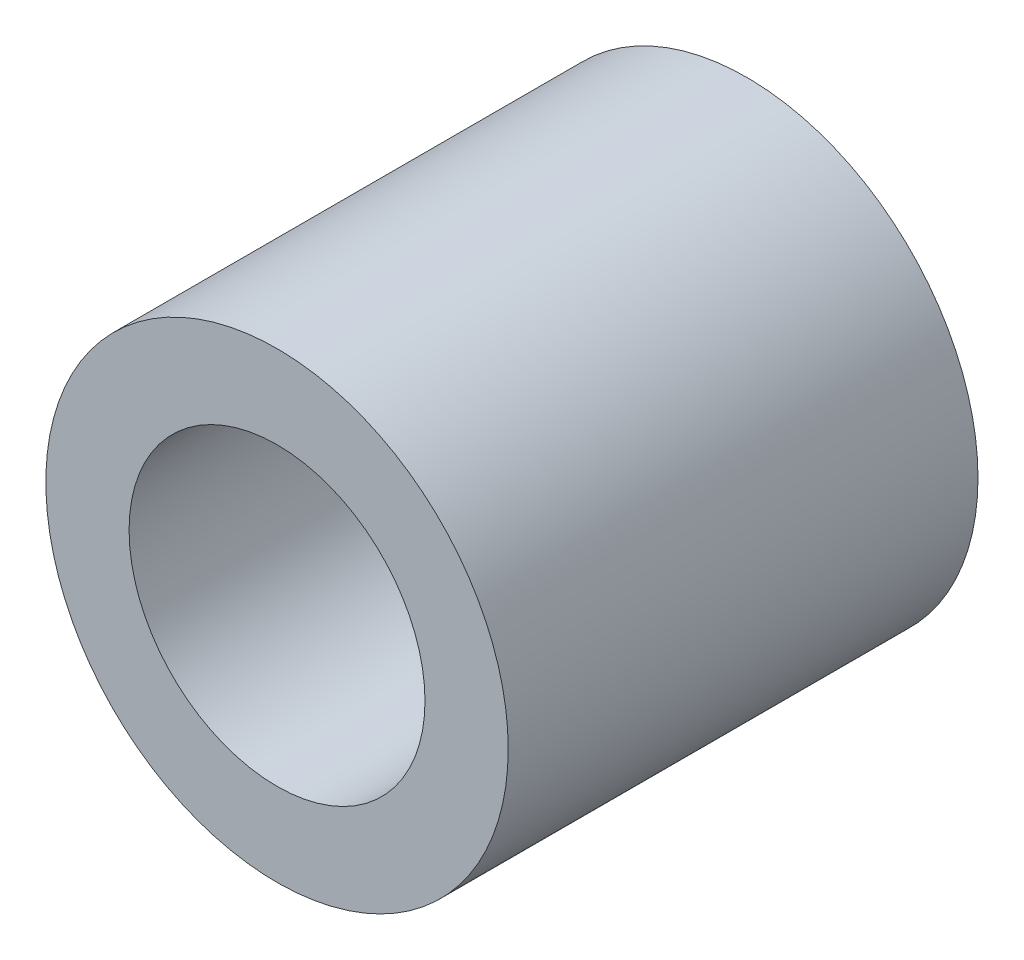
ISO-10303-21;
HEADER;
FILE_DESCRIPTION(('STEP AP214'),'2;1');
FILE_NAME('part.step','',(''),(''),'','','');
FILE_SCHEMA(('AUTOMOTIVE_DESIGN { 1 0 10303 214 1 1 1 1 }'));
ENDSEC;
DATA;
#1=APPLICATION_CONTEXT('core data for automotive mechanical design processes');
#2=APPLICATION_PROTOCOL_DEFINITION('international standard','automotive_design',2000,#1);
#3=PRODUCT_CONTEXT('',#1,'mechanical');
#4=PRODUCT('Part','Part','',(#3));
#5=PRODUCT_RELATED_PRODUCT_CATEGORY('part','',(#4));
#6=PRODUCT_DEFINITION_FORMATION('','',#4);
#7=PRODUCT_DEFINITION_CONTEXT('part definition',#1,'design');
#8=PRODUCT_DEFINITION('design','',#6,#7);
#9=PRODUCT_DEFINITION_SHAPE('','',#8);
#10=(LENGTH_UNIT() NAMED_UNIT(*) SI_UNIT(.MILLI.,.METRE.));
#11=(NAMED_UNIT(*) PLANE_ANGLE_UNIT() SI_UNIT($,.RADIAN.));
#12=(NAMED_UNIT(*) SI_UNIT($,.STERADIAN.) SOLID_ANGLE_UNIT());
#13=UNCERTAINTY_MEASURE_WITH_UNIT(LENGTH_MEASURE(1.E-05),#10,'distance_accuracy_value','');
#14=(GEOMETRIC_REPRESENTATION_CONTEXT(3) GLOBAL_UNCERTAINTY_ASSIGNED_CONTEXT((#13)) GLOBAL_UNIT_ASSIGNED_CONTEXT((#10,
#11,#12)) REPRESENTATION_CONTEXT('',''));
#15=CARTESIAN_POINT('',(0.,0.,0.));
#16=DIRECTION('',(0.,0.,1.));
#17=DIRECTION('',(1.,0.,0.));
#18=AXIS2_PLACEMENT_3D('',#15,#16,#17);
#19=CARTESIAN_POINT('',(0.,0.,5.08));
#20=DIRECTION('',(0.,0.,1.));
#21=DIRECTION('',(1.,0.,0.));
#22=AXIS2_PLACEMENT_3D('',#19,#20,#21);
#23=PLANE('',#22);
#24=CARTESIAN_POINT('',(0.,0.,5.08));
#25=DIRECTION('',(0.,0.,1.));
#26=DIRECTION('',(1.,0.,0.));
#27=AXIS2_PLACEMENT_3D('',#24,#25,#26);
#28=CIRCLE('',#27,2.5);
#29=CARTESIAN_POINT('',(2.5,0.,5.08));
#30=VERTEX_POINT('',#29);
#31=EDGE_CURVE('E10',#30,#30,#28,.T.);
#32=ORIENTED_EDGE('',*,*,#31,.T.);
#33=EDGE_LOOP('',(#32));
#34=FACE_BOUND('',#33,.T.);
#35=CARTESIAN_POINT('',(0.,0.,5.08));
#36=DIRECTION('',(0.,0.,1.));
#37=DIRECTION('',(1.,0.,0.));
#38=AXIS2_PLACEMENT_3D('',#35,#36,#37);
#39=CIRCLE('',#38,1.6);
#40=CARTESIAN_POINT('',(1.6,0.,5.08));
#41=VERTEX_POINT('',#40);
#42=EDGE_CURVE('E56',#41,#41,#39,.T.);
#43=ORIENTED_EDGE('',*,*,#42,.F.);
#44=EDGE_LOOP('',(#43));
#45=FACE_BOUND('',#44,.T.);
#46=ADVANCED_FACE('F43',(#34,#45),#23,.T.);
#47=CARTESIAN_POINT('',(0.,0.,0.));
#48=DIRECTION('',(0.,0.,1.));
#49=DIRECTION('',(1.,0.,0.));
#50=AXIS2_PLACEMENT_3D('',#47,#48,#49);
#51=PLANE('',#50);
#52=CARTESIAN_POINT('',(0.,0.,0.));
#53=DIRECTION('',(0.,0.,1.));
#54=DIRECTION('',(1.,0.,0.));
#55=AXIS2_PLACEMENT_3D('',#52,#53,#54);
#56=CIRCLE('',#55,2.5);
#57=CARTESIAN_POINT('',(2.5,0.,0.));
#58=VERTEX_POINT('',#57);
#59=EDGE_CURVE('E47',#58,#58,#56,.T.);
#60=ORIENTED_EDGE('',*,*,#59,.F.);
#61=EDGE_LOOP('',(#60));
#62=FACE_BOUND('',#61,.T.);
#63=CARTESIAN_POINT('',(0.,0.,0.));
#64=DIRECTION('',(0.,0.,1.));
#65=DIRECTION('',(1.,0.,0.));
#66=AXIS2_PLACEMENT_3D('',#63,#64,#65);
#67=CIRCLE('',#66,1.6);
#68=CARTESIAN_POINT('',(1.6,0.,0.));
#69=VERTEX_POINT('',#68);
#70=EDGE_CURVE('E58',#69,#69,#67,.T.);
#71=ORIENTED_EDGE('',*,*,#70,.T.);
#72=EDGE_LOOP('',(#71));
#73=FACE_BOUND('',#72,.T.);
#74=ADVANCED_FACE('F70',(#62,#73),#51,.F.);
#75=CARTESIAN_POINT('',(0.,0.,5.08));
#76=DIRECTION('',(0.,0.,-1.));
#77=DIRECTION('',(-1.,0.,0.));
#78=AXIS2_PLACEMENT_3D('',#75,#76,#77);
#79=CYLINDRICAL_SURFACE('',#78,2.5);
#80=ORIENTED_EDGE('',*,*,#31,.F.);
#81=EDGE_LOOP('',(#80));
#82=FACE_BOUND('',#81,.T.);
#83=ORIENTED_EDGE('',*,*,#59,.T.);
#84=EDGE_LOOP('',(#83));
#85=FACE_BOUND('',#84,.T.);
#86=ADVANCED_FACE('F45',(#82,#85),#79,.T.);
#87=CARTESIAN_POINT('',(0.,0.,5.08));
#88=DIRECTION('',(0.,0.,-1.));
#89=DIRECTION('',(-1.,0.,0.));
#90=AXIS2_PLACEMENT_3D('',#87,#88,#89);
#91=CYLINDRICAL_SURFACE('',#90,1.6);
#92=ORIENTED_EDGE('',*,*,#42,.T.);
#93=EDGE_LOOP('',(#92));
#94=FACE_BOUND('',#93,.T.);
#95=ORIENTED_EDGE('',*,*,#70,.F.);
#96=EDGE_LOOP('',(#95));
#97=FACE_BOUND('',#96,.T.);
#98=ADVANCED_FACE('F66',(#94,#97),#91,.F.);
#99=CLOSED_SHELL('',(#46,#74,#86,#98));
#100=MANIFOLD_SOLID_BREP('B2',#99);
#101=ADVANCED_BREP_SHAPE_REPRESENTATION('',(#18,#100),#14);
#102=SHAPE_DEFINITION_REPRESENTATION(#9,#101);
ENDSEC;
END-ISO-10303-21;
